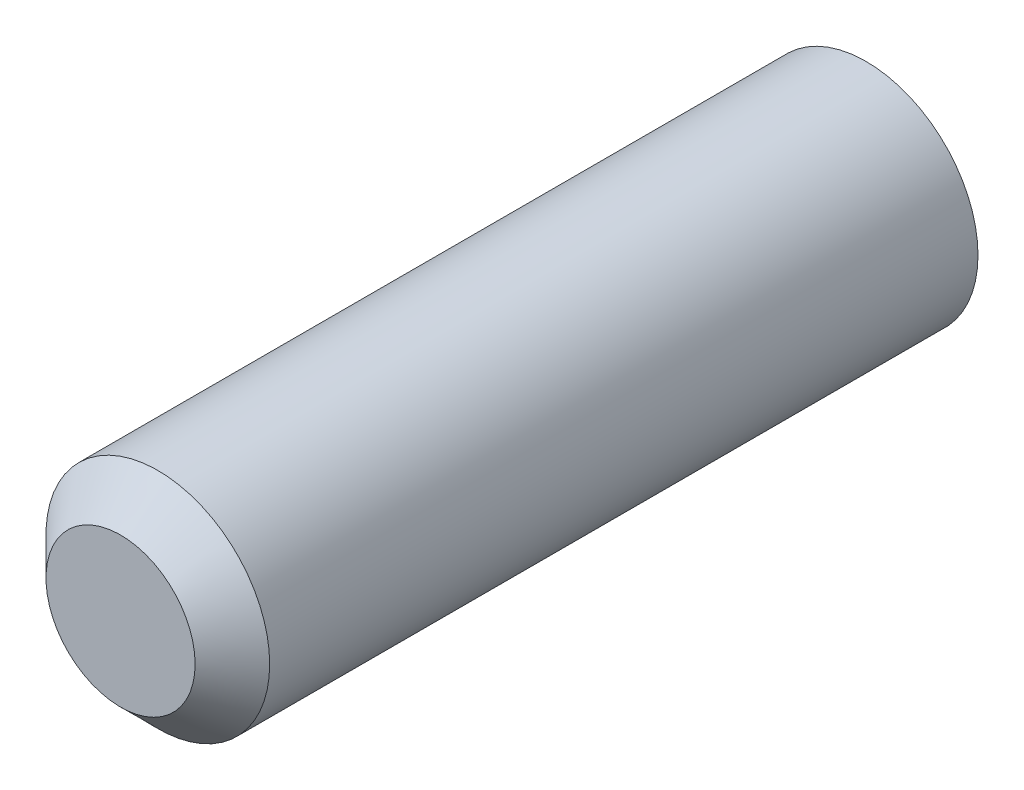
ISO-10303-21;
HEADER;
FILE_DESCRIPTION(('STEP AP214'),'2;1');
FILE_NAME('part.step','',(''),(''),'','','');
FILE_SCHEMA(('AUTOMOTIVE_DESIGN { 1 0 10303 214 1 1 1 1 }'));
ENDSEC;
DATA;
#1=APPLICATION_CONTEXT('core data for automotive mechanical design processes');
#2=APPLICATION_PROTOCOL_DEFINITION('international standard','automotive_design',2000,#1);
#3=PRODUCT_CONTEXT('',#1,'mechanical');
#4=PRODUCT('Part','Part','',(#3));
#5=PRODUCT_RELATED_PRODUCT_CATEGORY('part','',(#4));
#6=PRODUCT_DEFINITION_FORMATION('','',#4);
#7=PRODUCT_DEFINITION_CONTEXT('part definition',#1,'design');
#8=PRODUCT_DEFINITION('design','',#6,#7);
#9=PRODUCT_DEFINITION_SHAPE('','',#8);
#10=(LENGTH_UNIT() NAMED_UNIT(*) SI_UNIT(.MILLI.,.METRE.));
#11=(NAMED_UNIT(*) PLANE_ANGLE_UNIT() SI_UNIT($,.RADIAN.));
#12=(NAMED_UNIT(*) SI_UNIT($,.STERADIAN.) SOLID_ANGLE_UNIT());
#13=UNCERTAINTY_MEASURE_WITH_UNIT(LENGTH_MEASURE(1.E-05),#10,'distance_accuracy_value','');
#14=(GEOMETRIC_REPRESENTATION_CONTEXT(3) GLOBAL_UNCERTAINTY_ASSIGNED_CONTEXT((#13)) GLOBAL_UNIT_ASSIGNED_CONTEXT((#10,
#11,#12)) REPRESENTATION_CONTEXT('',''));
#15=CARTESIAN_POINT('',(0.,0.,0.));
#16=DIRECTION('',(0.,0.,1.));
#17=DIRECTION('',(1.,0.,0.));
#18=AXIS2_PLACEMENT_3D('',#15,#16,#17);
#19=CARTESIAN_POINT('',(0.,0.,10.));
#20=DIRECTION('',(0.,0.,-1.));
#21=DIRECTION('',(-1.,0.,0.));
#22=AXIS2_PLACEMENT_3D('',#19,#20,#21);
#23=CYLINDRICAL_SURFACE('',#22,1.5);
#24=CARTESIAN_POINT('',(0.,0.,9.5));
#25=DIRECTION('',(0.,0.,1.));
#26=DIRECTION('',(1.,0.,0.));
#27=AXIS2_PLACEMENT_3D('',#24,#25,#26);
#28=CIRCLE('',#27,1.5);
#29=CARTESIAN_POINT('',(1.5,0.,9.5));
#30=VERTEX_POINT('',#29);
#31=EDGE_CURVE('E10',#30,#30,#28,.F.);
#32=ORIENTED_EDGE('',*,*,#31,.T.);
#33=EDGE_LOOP('',(#32));
#34=FACE_BOUND('',#33,.T.);
#35=CARTESIAN_POINT('',(0.,0.,0.));
#36=DIRECTION('',(0.,0.,1.));
#37=DIRECTION('',(1.,0.,0.));
#38=AXIS2_PLACEMENT_3D('',#35,#36,#37);
#39=CIRCLE('',#38,1.5);
#40=CARTESIAN_POINT('',(1.5,0.,0.));
#41=VERTEX_POINT('',#40);
#42=EDGE_CURVE('E40',#41,#41,#39,.T.);
#43=ORIENTED_EDGE('',*,*,#42,.T.);
#44=EDGE_LOOP('',(#43));
#45=FACE_BOUND('',#44,.T.);
#46=ADVANCED_FACE('F29',(#34,#45),#23,.T.);
#47=CARTESIAN_POINT('',(0.,0.,10.));
#48=DIRECTION('',(0.,0.,1.));
#49=DIRECTION('',(1.,0.,0.));
#50=AXIS2_PLACEMENT_3D('',#47,#48,#49);
#51=PLANE('',#50);
#52=CARTESIAN_POINT('',(0.,0.,10.));
#53=DIRECTION('',(0.,0.,1.));
#54=DIRECTION('',(1.,0.,0.));
#55=AXIS2_PLACEMENT_3D('',#52,#53,#54);
#56=CIRCLE('',#55,0.999999999999997);
#57=CARTESIAN_POINT('',(0.999999999999997,0.,10.));
#58=VERTEX_POINT('',#57);
#59=EDGE_CURVE('E36',#58,#58,#56,.T.);
#60=ORIENTED_EDGE('',*,*,#59,.T.);
#61=EDGE_LOOP('',(#60));
#62=FACE_BOUND('',#61,.T.);
#63=ADVANCED_FACE('F50',(#62),#51,.T.);
#64=CARTESIAN_POINT('',(0.,0.,0.));
#65=DIRECTION('',(0.,0.,1.));
#66=DIRECTION('',(1.,0.,0.));
#67=AXIS2_PLACEMENT_3D('',#64,#65,#66);
#68=PLANE('',#67);
#69=ORIENTED_EDGE('',*,*,#42,.F.);
#70=EDGE_LOOP('',(#69));
#71=FACE_BOUND('',#70,.T.);
#72=ADVANCED_FACE('F48',(#71),#68,.F.);
#73=CARTESIAN_POINT('',(0.,0.,10.));
#74=DIRECTION('',(0.,0.,-1.));
#75=DIRECTION('',(-1.,0.,0.));
#76=AXIS2_PLACEMENT_3D('',#73,#74,#75);
#77=CONICAL_SURFACE('',#76,0.999999999999997,0.785398163397448);
#78=ORIENTED_EDGE('',*,*,#31,.F.);
#79=EDGE_LOOP('',(#78));
#80=FACE_BOUND('',#79,.T.);
#81=ORIENTED_EDGE('',*,*,#59,.F.);
#82=EDGE_LOOP('',(#81));
#83=FACE_BOUND('',#82,.T.);
#84=ADVANCED_FACE('F31',(#80,#83),#77,.T.);
#85=CLOSED_SHELL('',(#46,#63,#72,#84));
#86=MANIFOLD_SOLID_BREP('B2',#85);
#87=ADVANCED_BREP_SHAPE_REPRESENTATION('',(#18,#86),#14);
#88=SHAPE_DEFINITION_REPRESENTATION(#9,#87);
ENDSEC;
END-ISO-10303-21;
